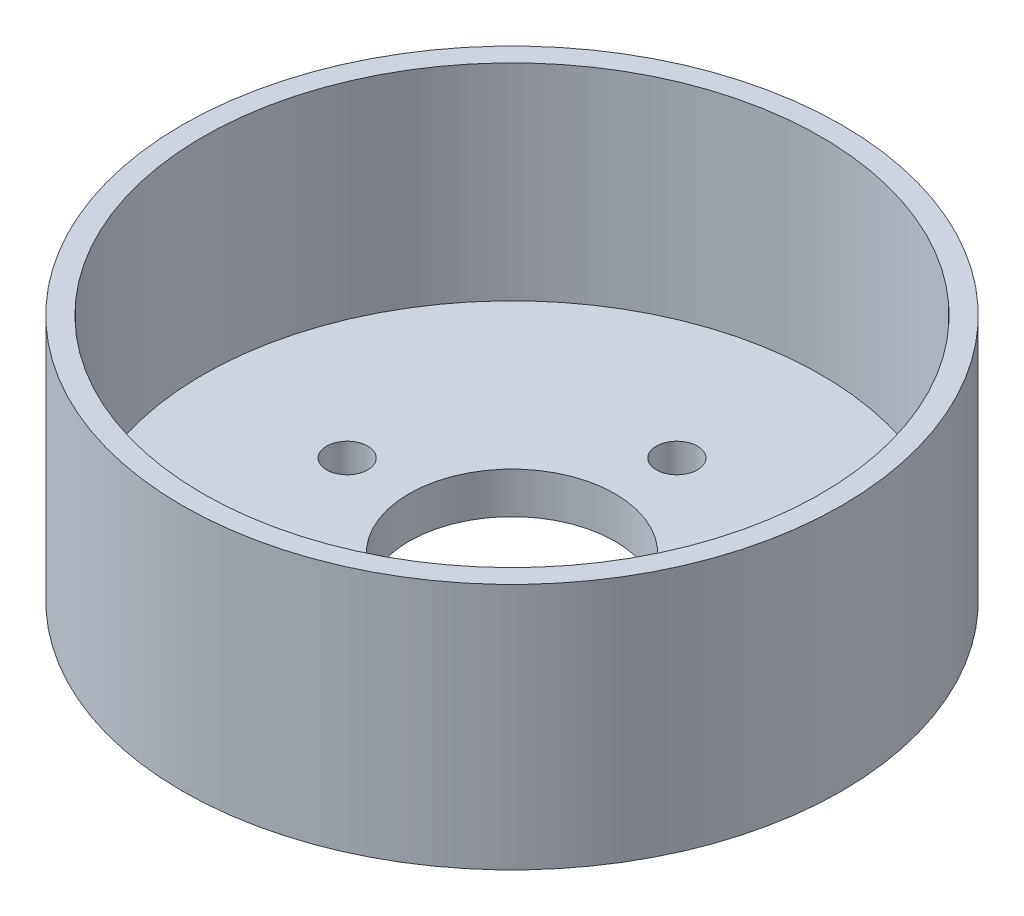
ISO-10303-21;
HEADER;
FILE_DESCRIPTION(('STEP AP214'),'2;1');
FILE_NAME('part.step','',(''),(''),'','','');
FILE_SCHEMA(('AUTOMOTIVE_DESIGN { 1 0 10303 214 1 1 1 1 }'));
ENDSEC;
DATA;
#1=APPLICATION_CONTEXT('core data for automotive mechanical design processes');
#2=APPLICATION_PROTOCOL_DEFINITION('international standard','automotive_design',2000,#1);
#3=PRODUCT_CONTEXT('',#1,'mechanical');
#4=PRODUCT('Part','Part','',(#3));
#5=PRODUCT_RELATED_PRODUCT_CATEGORY('part','',(#4));
#6=PRODUCT_DEFINITION_FORMATION('','',#4);
#7=PRODUCT_DEFINITION_CONTEXT('part definition',#1,'design');
#8=PRODUCT_DEFINITION('design','',#6,#7);
#9=PRODUCT_DEFINITION_SHAPE('','',#8);
#10=(LENGTH_UNIT() NAMED_UNIT(*) SI_UNIT(.MILLI.,.METRE.));
#11=(NAMED_UNIT(*) PLANE_ANGLE_UNIT() SI_UNIT($,.RADIAN.));
#12=(NAMED_UNIT(*) SI_UNIT($,.STERADIAN.) SOLID_ANGLE_UNIT());
#13=UNCERTAINTY_MEASURE_WITH_UNIT(LENGTH_MEASURE(1.E-05),#10,'distance_accuracy_value','');
#14=(GEOMETRIC_REPRESENTATION_CONTEXT(3) GLOBAL_UNCERTAINTY_ASSIGNED_CONTEXT((#13)) GLOBAL_UNIT_ASSIGNED_CONTEXT((#10,
#11,#12)) REPRESENTATION_CONTEXT('',''));
#15=CARTESIAN_POINT('',(0.,0.,0.));
#16=DIRECTION('',(0.,0.,1.));
#17=DIRECTION('',(1.,0.,0.));
#18=AXIS2_PLACEMENT_3D('',#15,#16,#17);
#19=CARTESIAN_POINT('',(0.,12.5,0.));
#20=DIRECTION('',(0.,-1.,0.));
#21=DIRECTION('',(0.,0.,-1.));
#22=AXIS2_PLACEMENT_3D('',#19,#20,#21);
#23=CYLINDRICAL_SURFACE('',#22,16.);
#24=CARTESIAN_POINT('',(0.,12.5,0.));
#25=DIRECTION('',(0.,1.,0.));
#26=DIRECTION('',(0.,0.,1.));
#27=AXIS2_PLACEMENT_3D('',#24,#25,#26);
#28=CIRCLE('',#27,16.);
#29=CARTESIAN_POINT('',(0.,12.5,16.));
#30=VERTEX_POINT('',#29);
#31=EDGE_CURVE('E10',#30,#30,#28,.T.);
#32=ORIENTED_EDGE('',*,*,#31,.F.);
#33=EDGE_LOOP('',(#32));
#34=FACE_BOUND('',#33,.T.);
#35=CARTESIAN_POINT('',(0.,0.5,0.));
#36=DIRECTION('',(0.,-1.,0.));
#37=DIRECTION('',(0.,0.,-1.));
#38=AXIS2_PLACEMENT_3D('',#35,#36,#37);
#39=CIRCLE('',#38,16.);
#40=CARTESIAN_POINT('',(0.,0.5,-16.));
#41=VERTEX_POINT('',#40);
#42=EDGE_CURVE('E108',#41,#41,#39,.T.);
#43=ORIENTED_EDGE('',*,*,#42,.F.);
#44=EDGE_LOOP('',(#43));
#45=FACE_BOUND('',#44,.T.);
#46=ADVANCED_FACE('F31',(#34,#45),#23,.T.);
#47=CARTESIAN_POINT('',(0.,10.,0.));
#48=DIRECTION('',(0.,-1.,0.));
#49=DIRECTION('',(0.,0.,-1.));
#50=AXIS2_PLACEMENT_3D('',#47,#48,#49);
#51=CYLINDRICAL_SURFACE('',#50,5.);
#52=CARTESIAN_POINT('',(0.,2.5,0.));
#53=DIRECTION('',(0.,1.,0.));
#54=DIRECTION('',(0.,0.,1.));
#55=AXIS2_PLACEMENT_3D('',#52,#53,#54);
#56=CIRCLE('',#55,5.);
#57=CARTESIAN_POINT('',(0.,2.5,5.));
#58=VERTEX_POINT('',#57);
#59=EDGE_CURVE('E47',#58,#58,#56,.T.);
#60=ORIENTED_EDGE('',*,*,#59,.T.);
#61=EDGE_LOOP('',(#60));
#62=FACE_BOUND('',#61,.T.);
#63=CARTESIAN_POINT('',(0.,0.5,0.));
#64=DIRECTION('',(0.,-1.,0.));
#65=DIRECTION('',(0.,0.,-1.));
#66=AXIS2_PLACEMENT_3D('',#63,#64,#65);
#67=CIRCLE('',#66,5.);
#68=CARTESIAN_POINT('',(0.,0.5,-5.));
#69=VERTEX_POINT('',#68);
#70=EDGE_CURVE('E55',#69,#69,#67,.F.);
#71=ORIENTED_EDGE('',*,*,#70,.F.);
#72=EDGE_LOOP('',(#71));
#73=FACE_BOUND('',#72,.T.);
#74=ADVANCED_FACE('F96',(#62,#73),#51,.F.);
#75=CARTESIAN_POINT('',(8.,10.,0.));
#76=DIRECTION('',(0.,-1.,0.));
#77=DIRECTION('',(0.,0.,-1.));
#78=AXIS2_PLACEMENT_3D('',#75,#76,#77);
#79=CYLINDRICAL_SURFACE('',#78,1.);
#80=CARTESIAN_POINT('',(8.,2.5,0.));
#81=DIRECTION('',(0.,1.,0.));
#82=DIRECTION('',(0.,0.,1.));
#83=AXIS2_PLACEMENT_3D('',#80,#81,#82);
#84=CIRCLE('',#83,1.);
#85=CARTESIAN_POINT('',(8.,2.5,1.));
#86=VERTEX_POINT('',#85);
#87=EDGE_CURVE('E51',#86,#86,#84,.T.);
#88=ORIENTED_EDGE('',*,*,#87,.T.);
#89=EDGE_LOOP('',(#88));
#90=FACE_BOUND('',#89,.T.);
#91=CARTESIAN_POINT('',(8.,0.5,0.));
#92=DIRECTION('',(0.,-1.,0.));
#93=DIRECTION('',(0.,0.,-1.));
#94=AXIS2_PLACEMENT_3D('',#91,#92,#93);
#95=CIRCLE('',#94,1.);
#96=CARTESIAN_POINT('',(8.,0.5,-1.));
#97=VERTEX_POINT('',#96);
#98=EDGE_CURVE('E119',#97,#97,#95,.F.);
#99=ORIENTED_EDGE('',*,*,#98,.F.);
#100=EDGE_LOOP('',(#99));
#101=FACE_BOUND('',#100,.T.);
#102=ADVANCED_FACE('F102',(#90,#101),#79,.F.);
#103=CARTESIAN_POINT('',(0.,10.,8.));
#104=DIRECTION('',(0.,-1.,0.));
#105=DIRECTION('',(0.,0.,-1.));
#106=AXIS2_PLACEMENT_3D('',#103,#104,#105);
#107=CYLINDRICAL_SURFACE('',#106,1.);
#108=CARTESIAN_POINT('',(0.,2.5,8.));
#109=DIRECTION('',(0.,1.,0.));
#110=DIRECTION('',(0.,0.,1.));
#111=AXIS2_PLACEMENT_3D('',#108,#109,#110);
#112=CIRCLE('',#111,1.);
#113=CARTESIAN_POINT('',(0.,2.5,9.));
#114=VERTEX_POINT('',#113);
#115=EDGE_CURVE('E54',#114,#114,#112,.T.);
#116=ORIENTED_EDGE('',*,*,#115,.T.);
#117=EDGE_LOOP('',(#116));
#118=FACE_BOUND('',#117,.T.);
#119=CARTESIAN_POINT('',(0.,0.5,8.));
#120=DIRECTION('',(0.,-1.,0.));
#121=DIRECTION('',(0.,0.,-1.));
#122=AXIS2_PLACEMENT_3D('',#119,#120,#121);
#123=CIRCLE('',#122,1.);
#124=CARTESIAN_POINT('',(0.,0.5,7.));
#125=VERTEX_POINT('',#124);
#126=EDGE_CURVE('E116',#125,#125,#123,.F.);
#127=ORIENTED_EDGE('',*,*,#126,.F.);
#128=EDGE_LOOP('',(#127));
#129=FACE_BOUND('',#128,.T.);
#130=ADVANCED_FACE('F135',(#118,#129),#107,.F.);
#131=CARTESIAN_POINT('',(-8.,10.,0.));
#132=DIRECTION('',(0.,-1.,0.));
#133=DIRECTION('',(0.,0.,-1.));
#134=AXIS2_PLACEMENT_3D('',#131,#132,#133);
#135=CYLINDRICAL_SURFACE('',#134,1.);
#136=CARTESIAN_POINT('',(-8.,2.5,0.));
#137=DIRECTION('',(0.,1.,0.));
#138=DIRECTION('',(0.,0.,1.));
#139=AXIS2_PLACEMENT_3D('',#136,#137,#138);
#140=CIRCLE('',#139,1.);
#141=CARTESIAN_POINT('',(-8.,2.5,1.));
#142=VERTEX_POINT('',#141);
#143=EDGE_CURVE('E58',#142,#142,#140,.T.);
#144=ORIENTED_EDGE('',*,*,#143,.T.);
#145=EDGE_LOOP('',(#144));
#146=FACE_BOUND('',#145,.T.);
#147=CARTESIAN_POINT('',(-8.,0.5,0.));
#148=DIRECTION('',(0.,-1.,0.));
#149=DIRECTION('',(0.,0.,-1.));
#150=AXIS2_PLACEMENT_3D('',#147,#148,#149);
#151=CIRCLE('',#150,1.);
#152=CARTESIAN_POINT('',(-8.,0.5,-1.));
#153=VERTEX_POINT('',#152);
#154=EDGE_CURVE('E112',#153,#153,#151,.F.);
#155=ORIENTED_EDGE('',*,*,#154,.F.);
#156=EDGE_LOOP('',(#155));
#157=FACE_BOUND('',#156,.T.);
#158=ADVANCED_FACE('F93',(#146,#157),#135,.F.);
#159=CARTESIAN_POINT('',(0.,10.,-8.));
#160=DIRECTION('',(0.,-1.,0.));
#161=DIRECTION('',(0.,0.,-1.));
#162=AXIS2_PLACEMENT_3D('',#159,#160,#161);
#163=CYLINDRICAL_SURFACE('',#162,1.);
#164=CARTESIAN_POINT('',(0.,2.5,-8.));
#165=DIRECTION('',(0.,1.,0.));
#166=DIRECTION('',(0.,0.,1.));
#167=AXIS2_PLACEMENT_3D('',#164,#165,#166);
#168=CIRCLE('',#167,1.);
#169=CARTESIAN_POINT('',(0.,2.5,-7.));
#170=VERTEX_POINT('',#169);
#171=EDGE_CURVE('E50',#170,#170,#168,.T.);
#172=ORIENTED_EDGE('',*,*,#171,.T.);
#173=EDGE_LOOP('',(#172));
#174=FACE_BOUND('',#173,.T.);
#175=CARTESIAN_POINT('',(0.,0.5,-8.));
#176=DIRECTION('',(0.,-1.,0.));
#177=DIRECTION('',(0.,0.,-1.));
#178=AXIS2_PLACEMENT_3D('',#175,#176,#177);
#179=CIRCLE('',#178,1.);
#180=CARTESIAN_POINT('',(0.,0.5,-9.));
#181=VERTEX_POINT('',#180);
#182=EDGE_CURVE('E34',#181,#181,#179,.F.);
#183=ORIENTED_EDGE('',*,*,#182,.F.);
#184=EDGE_LOOP('',(#183));
#185=FACE_BOUND('',#184,.T.);
#186=ADVANCED_FACE('F63',(#174,#185),#163,.F.);
#187=CARTESIAN_POINT('',(0.,12.5,0.));
#188=DIRECTION('',(0.,1.,0.));
#189=DIRECTION('',(0.,0.,1.));
#190=AXIS2_PLACEMENT_3D('',#187,#188,#189);
#191=PLANE('',#190);
#192=CARTESIAN_POINT('',(0.,12.5,0.));
#193=DIRECTION('',(0.,1.,0.));
#194=DIRECTION('',(0.,0.,1.));
#195=AXIS2_PLACEMENT_3D('',#192,#193,#194);
#196=CIRCLE('',#195,15.);
#197=CARTESIAN_POINT('',(0.,12.5,15.));
#198=VERTEX_POINT('',#197);
#199=EDGE_CURVE('E43',#198,#198,#196,.T.);
#200=ORIENTED_EDGE('',*,*,#199,.F.);
#201=EDGE_LOOP('',(#200));
#202=FACE_BOUND('',#201,.T.);
#203=ORIENTED_EDGE('',*,*,#31,.T.);
#204=EDGE_LOOP('',(#203));
#205=FACE_BOUND('',#204,.T.);
#206=ADVANCED_FACE('F84',(#202,#205),#191,.T.);
#207=CARTESIAN_POINT('',(0.,2.5,0.));
#208=DIRECTION('',(0.,1.,0.));
#209=DIRECTION('',(0.,0.,1.));
#210=AXIS2_PLACEMENT_3D('',#207,#208,#209);
#211=CYLINDRICAL_SURFACE('',#210,15.);
#212=CARTESIAN_POINT('',(0.,2.5,0.));
#213=DIRECTION('',(0.,1.,0.));
#214=DIRECTION('',(0.,0.,1.));
#215=AXIS2_PLACEMENT_3D('',#212,#213,#214);
#216=CIRCLE('',#215,15.);
#217=CARTESIAN_POINT('',(0.,2.5,15.));
#218=VERTEX_POINT('',#217);
#219=EDGE_CURVE('E38',#218,#218,#216,.T.);
#220=ORIENTED_EDGE('',*,*,#219,.F.);
#221=EDGE_LOOP('',(#220));
#222=FACE_BOUND('',#221,.T.);
#223=ORIENTED_EDGE('',*,*,#199,.T.);
#224=EDGE_LOOP('',(#223));
#225=FACE_BOUND('',#224,.T.);
#226=ADVANCED_FACE('F70',(#222,#225),#211,.F.);
#227=CARTESIAN_POINT('',(0.,2.5,0.));
#228=DIRECTION('',(0.,1.,0.));
#229=DIRECTION('',(0.,0.,1.));
#230=AXIS2_PLACEMENT_3D('',#227,#228,#229);
#231=PLANE('',#230);
#232=ORIENTED_EDGE('',*,*,#171,.F.);
#233=EDGE_LOOP('',(#232));
#234=FACE_BOUND('',#233,.T.);
#235=ORIENTED_EDGE('',*,*,#143,.F.);
#236=EDGE_LOOP('',(#235));
#237=FACE_BOUND('',#236,.T.);
#238=ORIENTED_EDGE('',*,*,#115,.F.);
#239=EDGE_LOOP('',(#238));
#240=FACE_BOUND('',#239,.T.);
#241=ORIENTED_EDGE('',*,*,#87,.F.);
#242=EDGE_LOOP('',(#241));
#243=FACE_BOUND('',#242,.T.);
#244=ORIENTED_EDGE('',*,*,#59,.F.);
#245=EDGE_LOOP('',(#244));
#246=FACE_BOUND('',#245,.T.);
#247=ORIENTED_EDGE('',*,*,#219,.T.);
#248=EDGE_LOOP('',(#247));
#249=FACE_BOUND('',#248,.T.);
#250=ADVANCED_FACE('F66',(#234,#237,#240,#243,#246,#249),#231,.T.);
#251=CARTESIAN_POINT('',(0.,0.5,0.));
#252=DIRECTION('',(0.,-1.,0.));
#253=DIRECTION('',(0.,0.,-1.));
#254=AXIS2_PLACEMENT_3D('',#251,#252,#253);
#255=PLANE('',#254);
#256=ORIENTED_EDGE('',*,*,#42,.T.);
#257=EDGE_LOOP('',(#256));
#258=FACE_BOUND('',#257,.T.);
#259=ORIENTED_EDGE('',*,*,#182,.T.);
#260=EDGE_LOOP('',(#259));
#261=FACE_BOUND('',#260,.T.);
#262=ORIENTED_EDGE('',*,*,#154,.T.);
#263=EDGE_LOOP('',(#262));
#264=FACE_BOUND('',#263,.T.);
#265=ORIENTED_EDGE('',*,*,#126,.T.);
#266=EDGE_LOOP('',(#265));
#267=FACE_BOUND('',#266,.T.);
#268=ORIENTED_EDGE('',*,*,#98,.T.);
#269=EDGE_LOOP('',(#268));
#270=FACE_BOUND('',#269,.T.);
#271=ORIENTED_EDGE('',*,*,#70,.T.);
#272=EDGE_LOOP('',(#271));
#273=FACE_BOUND('',#272,.T.);
#274=ADVANCED_FACE('F69',(#258,#261,#264,#267,#270,#273),#255,.T.);
#275=CLOSED_SHELL('',(#46,#74,#102,#130,#158,#186,#206,#226,#250,#274));
#276=MANIFOLD_SOLID_BREP('B2',#275);
#277=ADVANCED_BREP_SHAPE_REPRESENTATION('',(#18,#276),#14);
#278=SHAPE_DEFINITION_REPRESENTATION(#9,#277);
ENDSEC;
END-ISO-10303-21;
